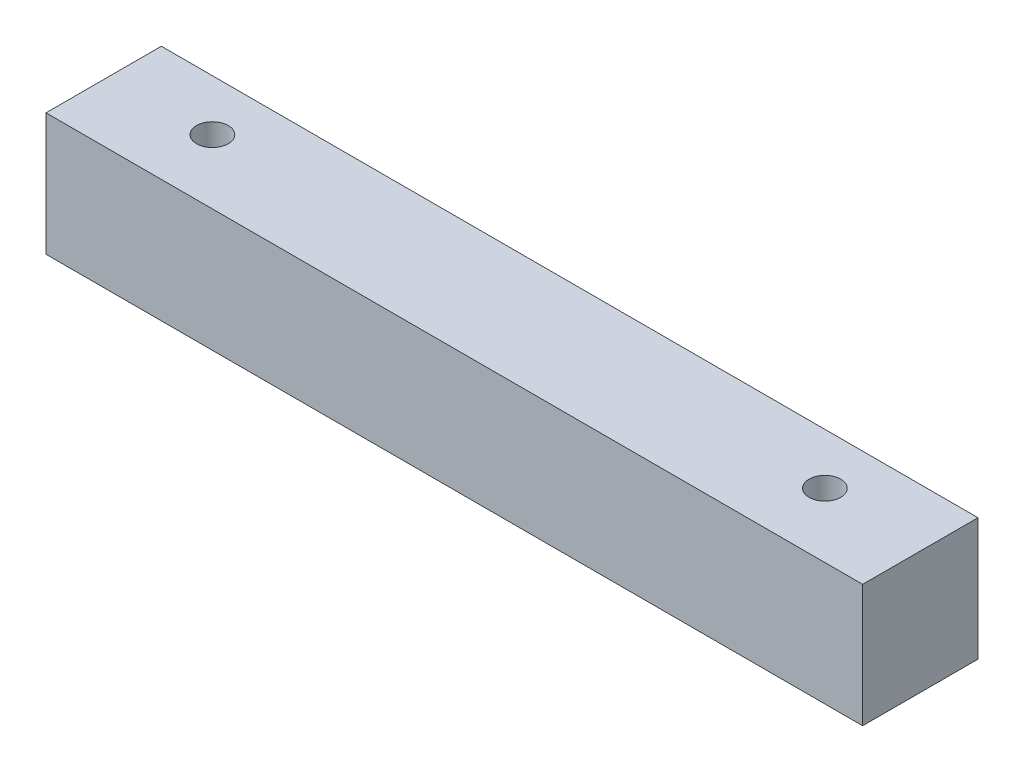
ISO-10303-21;
HEADER;
FILE_DESCRIPTION(('STEP AP214'),'2;1');
FILE_NAME('part.step','',(''),(''),'','','');
FILE_SCHEMA(('AUTOMOTIVE_DESIGN { 1 0 10303 214 1 1 1 1 }'));
ENDSEC;
DATA;
#1=APPLICATION_CONTEXT('core data for automotive mechanical design processes');
#2=APPLICATION_PROTOCOL_DEFINITION('international standard','automotive_design',2000,#1);
#3=PRODUCT_CONTEXT('',#1,'mechanical');
#4=PRODUCT('Part','Part','',(#3));
#5=PRODUCT_RELATED_PRODUCT_CATEGORY('part','',(#4));
#6=PRODUCT_DEFINITION_FORMATION('','',#4);
#7=PRODUCT_DEFINITION_CONTEXT('part definition',#1,'design');
#8=PRODUCT_DEFINITION('design','',#6,#7);
#9=PRODUCT_DEFINITION_SHAPE('','',#8);
#10=(LENGTH_UNIT() NAMED_UNIT(*) SI_UNIT(.MILLI.,.METRE.));
#11=(NAMED_UNIT(*) PLANE_ANGLE_UNIT() SI_UNIT($,.RADIAN.));
#12=(NAMED_UNIT(*) SI_UNIT($,.STERADIAN.) SOLID_ANGLE_UNIT());
#13=UNCERTAINTY_MEASURE_WITH_UNIT(LENGTH_MEASURE(1.E-05),#10,'distance_accuracy_value','');
#14=(GEOMETRIC_REPRESENTATION_CONTEXT(3) GLOBAL_UNCERTAINTY_ASSIGNED_CONTEXT((#13)) GLOBAL_UNIT_ASSIGNED_CONTEXT((#10,
#11,#12)) REPRESENTATION_CONTEXT('',''));
#15=CARTESIAN_POINT('',(0.,0.,0.));
#16=DIRECTION('',(0.,0.,1.));
#17=DIRECTION('',(1.,0.,0.));
#18=AXIS2_PLACEMENT_3D('',#15,#16,#17);
#19=CARTESIAN_POINT('',(0.,0.,11.5));
#20=DIRECTION('',(1.,0.,0.));
#21=DIRECTION('',(0.,0.,-1.));
#22=AXIS2_PLACEMENT_3D('',#19,#20,#21);
#23=PLANE('',#22);
#24=DIRECTION('',(0.,-1.,0.));
#25=VECTOR('',#24,1.);
#26=CARTESIAN_POINT('',(0.,12.,11.3));
#27=LINE('',#26,#25);
#28=CARTESIAN_POINT('',(0.,12.,11.3));
#29=VERTEX_POINT('',#28);
#30=CARTESIAN_POINT('',(0.,0.,11.3));
#31=VERTEX_POINT('',#30);
#32=EDGE_CURVE('E83',#29,#31,#27,.T.);
#33=ORIENTED_EDGE('',*,*,#32,.F.);
#34=DIRECTION('',(0.,0.,-1.));
#35=VECTOR('',#34,1.);
#36=CARTESIAN_POINT('',(0.,12.,11.5));
#37=LINE('',#36,#35);
#38=CARTESIAN_POINT('',(0.,12.,0.));
#39=VERTEX_POINT('',#38);
#40=EDGE_CURVE('E65',#29,#39,#37,.T.);
#41=ORIENTED_EDGE('',*,*,#40,.T.);
#42=DIRECTION('',(0.,-1.,0.));
#43=VECTOR('',#42,1.);
#44=CARTESIAN_POINT('',(0.,0.,0.));
#45=LINE('',#44,#43);
#46=CARTESIAN_POINT('',(0.,0.,0.));
#47=VERTEX_POINT('',#46);
#48=EDGE_CURVE('E119',#39,#47,#45,.T.);
#49=ORIENTED_EDGE('',*,*,#48,.T.);
#50=DIRECTION('',(0.,0.,-1.));
#51=VECTOR('',#50,1.);
#52=CARTESIAN_POINT('',(0.,0.,11.5));
#53=LINE('',#52,#51);
#54=EDGE_CURVE('E11',#31,#47,#53,.T.);
#55=ORIENTED_EDGE('',*,*,#54,.F.);
#56=EDGE_LOOP('',(#33,#41,#49,#55));
#57=FACE_BOUND('',#56,.T.);
#58=ADVANCED_FACE('F42',(#57),#23,.F.);
#59=CARTESIAN_POINT('',(0.,0.,11.5));
#60=DIRECTION('',(0.,1.,0.));
#61=DIRECTION('',(0.,0.,1.));
#62=AXIS2_PLACEMENT_3D('',#59,#60,#61);
#63=PLANE('',#62);
#64=CARTESIAN_POINT('',(70.,0.,5.00000000000001));
#65=DIRECTION('',(0.,1.,0.));
#66=DIRECTION('',(0.,0.,1.));
#67=AXIS2_PLACEMENT_3D('',#64,#65,#66);
#68=CIRCLE('',#67,1.55000000000001);
#69=CARTESIAN_POINT('',(70.,0.,6.55000000000002));
#70=VERTEX_POINT('',#69);
#71=EDGE_CURVE('E132',#70,#70,#68,.F.);
#72=ORIENTED_EDGE('',*,*,#71,.F.);
#73=EDGE_LOOP('',(#72));
#74=FACE_BOUND('',#73,.T.);
#75=CARTESIAN_POINT('',(9.99999999999999,0.,5.00000000000001));
#76=DIRECTION('',(0.,1.,0.));
#77=DIRECTION('',(0.,0.,1.));
#78=AXIS2_PLACEMENT_3D('',#75,#76,#77);
#79=CIRCLE('',#78,1.55);
#80=CARTESIAN_POINT('',(9.99999999999999,0.,6.55000000000001));
#81=VERTEX_POINT('',#80);
#82=EDGE_CURVE('E126',#81,#81,#79,.F.);
#83=ORIENTED_EDGE('',*,*,#82,.F.);
#84=EDGE_LOOP('',(#83));
#85=FACE_BOUND('',#84,.T.);
#86=DIRECTION('',(1.,0.,0.));
#87=VECTOR('',#86,1.);
#88=CARTESIAN_POINT('',(0.,0.,11.3));
#89=LINE('',#88,#87);
#90=CARTESIAN_POINT('',(80.,0.,11.3));
#91=VERTEX_POINT('',#90);
#92=EDGE_CURVE('E91',#31,#91,#89,.T.);
#93=ORIENTED_EDGE('',*,*,#92,.F.);
#94=ORIENTED_EDGE('',*,*,#54,.T.);
#95=DIRECTION('',(1.,0.,0.));
#96=VECTOR('',#95,1.);
#97=CARTESIAN_POINT('',(0.,0.,0.));
#98=LINE('',#97,#96);
#99=CARTESIAN_POINT('',(80.,0.,0.));
#100=VERTEX_POINT('',#99);
#101=EDGE_CURVE('E115',#47,#100,#98,.T.);
#102=ORIENTED_EDGE('',*,*,#101,.T.);
#103=DIRECTION('',(0.,0.,-1.));
#104=VECTOR('',#103,1.);
#105=CARTESIAN_POINT('',(80.,0.,11.5));
#106=LINE('',#105,#104);
#107=EDGE_CURVE('E50',#91,#100,#106,.T.);
#108=ORIENTED_EDGE('',*,*,#107,.F.);
#109=EDGE_LOOP('',(#93,#94,#102,#108));
#110=FACE_BOUND('',#109,.T.);
#111=ADVANCED_FACE('F116',(#74,#85,#110),#63,.F.);
#112=CARTESIAN_POINT('',(80.,0.,11.5));
#113=DIRECTION('',(-1.,0.,0.));
#114=DIRECTION('',(0.,0.,1.));
#115=AXIS2_PLACEMENT_3D('',#112,#113,#114);
#116=PLANE('',#115);
#117=DIRECTION('',(0.,1.,0.));
#118=VECTOR('',#117,1.);
#119=CARTESIAN_POINT('',(80.,0.,11.3));
#120=LINE('',#119,#118);
#121=CARTESIAN_POINT('',(80.,12.,11.3));
#122=VERTEX_POINT('',#121);
#123=EDGE_CURVE('E57',#91,#122,#120,.T.);
#124=ORIENTED_EDGE('',*,*,#123,.F.);
#125=ORIENTED_EDGE('',*,*,#107,.T.);
#126=DIRECTION('',(0.,1.,0.));
#127=VECTOR('',#126,1.);
#128=CARTESIAN_POINT('',(80.,0.,0.));
#129=LINE('',#128,#127);
#130=CARTESIAN_POINT('',(80.,12.,0.));
#131=VERTEX_POINT('',#130);
#132=EDGE_CURVE('E103',#100,#131,#129,.T.);
#133=ORIENTED_EDGE('',*,*,#132,.T.);
#134=DIRECTION('',(0.,0.,-1.));
#135=VECTOR('',#134,1.);
#136=CARTESIAN_POINT('',(80.,12.,11.5));
#137=LINE('',#136,#135);
#138=EDGE_CURVE('E98',#122,#131,#137,.T.);
#139=ORIENTED_EDGE('',*,*,#138,.F.);
#140=EDGE_LOOP('',(#124,#125,#133,#139));
#141=FACE_BOUND('',#140,.T.);
#142=ADVANCED_FACE('F111',(#141),#116,.F.);
#143=CARTESIAN_POINT('',(0.,12.,11.5));
#144=DIRECTION('',(0.,-1.,0.));
#145=DIRECTION('',(0.,0.,-1.));
#146=AXIS2_PLACEMENT_3D('',#143,#144,#145);
#147=PLANE('',#146);
#148=CARTESIAN_POINT('',(70.,12.,5.00000000000001));
#149=DIRECTION('',(0.,1.,0.));
#150=DIRECTION('',(0.,0.,-1.));
#151=AXIS2_PLACEMENT_3D('',#148,#149,#150);
#152=CIRCLE('',#151,1.55000000000001);
#153=CARTESIAN_POINT('',(70.,12.,3.45000000000001));
#154=VERTEX_POINT('',#153);
#155=EDGE_CURVE('E127',#154,#154,#152,.T.);
#156=ORIENTED_EDGE('',*,*,#155,.F.);
#157=EDGE_LOOP('',(#156));
#158=FACE_BOUND('',#157,.T.);
#159=CARTESIAN_POINT('',(9.99999999999999,12.,5.00000000000001));
#160=DIRECTION('',(0.,1.,0.));
#161=DIRECTION('',(0.,0.,1.));
#162=AXIS2_PLACEMENT_3D('',#159,#160,#161);
#163=CIRCLE('',#162,1.55);
#164=CARTESIAN_POINT('',(9.99999999999999,12.,6.55000000000001));
#165=VERTEX_POINT('',#164);
#166=EDGE_CURVE('E131',#165,#165,#163,.T.);
#167=ORIENTED_EDGE('',*,*,#166,.F.);
#168=EDGE_LOOP('',(#167));
#169=FACE_BOUND('',#168,.T.);
#170=DIRECTION('',(-1.,0.,0.));
#171=VECTOR('',#170,1.);
#172=CARTESIAN_POINT('',(80.,12.,11.3));
#173=LINE('',#172,#171);
#174=EDGE_CURVE('E81',#122,#29,#173,.T.);
#175=ORIENTED_EDGE('',*,*,#174,.F.);
#176=ORIENTED_EDGE('',*,*,#138,.T.);
#177=DIRECTION('',(-1.,0.,0.));
#178=VECTOR('',#177,1.);
#179=CARTESIAN_POINT('',(0.,12.,0.));
#180=LINE('',#179,#178);
#181=EDGE_CURVE('E95',#131,#39,#180,.T.);
#182=ORIENTED_EDGE('',*,*,#181,.T.);
#183=ORIENTED_EDGE('',*,*,#40,.F.);
#184=EDGE_LOOP('',(#175,#176,#182,#183));
#185=FACE_BOUND('',#184,.T.);
#186=ADVANCED_FACE('F93',(#158,#169,#185),#147,.F.);
#187=CARTESIAN_POINT('',(0.,0.,0.));
#188=DIRECTION('',(0.,0.,-1.));
#189=DIRECTION('',(-1.,0.,0.));
#190=AXIS2_PLACEMENT_3D('',#187,#188,#189);
#191=PLANE('',#190);
#192=ORIENTED_EDGE('',*,*,#48,.F.);
#193=ORIENTED_EDGE('',*,*,#181,.F.);
#194=ORIENTED_EDGE('',*,*,#132,.F.);
#195=ORIENTED_EDGE('',*,*,#101,.F.);
#196=EDGE_LOOP('',(#192,#193,#194,#195));
#197=FACE_BOUND('',#196,.T.);
#198=ADVANCED_FACE('F121',(#197),#191,.T.);
#199=CARTESIAN_POINT('',(70.,-0.000999999999999265,5.00000000000001));
#200=DIRECTION('',(0.,1.,0.));
#201=DIRECTION('',(0.,0.,1.));
#202=AXIS2_PLACEMENT_3D('',#199,#200,#201);
#203=CYLINDRICAL_SURFACE('',#202,1.55000000000001);
#204=ORIENTED_EDGE('',*,*,#155,.T.);
#205=EDGE_LOOP('',(#204));
#206=FACE_BOUND('',#205,.T.);
#207=ORIENTED_EDGE('',*,*,#71,.T.);
#208=EDGE_LOOP('',(#207));
#209=FACE_BOUND('',#208,.T.);
#210=ADVANCED_FACE('F158',(#206,#209),#203,.F.);
#211=CARTESIAN_POINT('',(9.99999999999999,-0.000999999999999265,5.00000000000001));
#212=DIRECTION('',(0.,1.,0.));
#213=DIRECTION('',(0.,0.,1.));
#214=AXIS2_PLACEMENT_3D('',#211,#212,#213);
#215=CYLINDRICAL_SURFACE('',#214,1.55);
#216=ORIENTED_EDGE('',*,*,#166,.T.);
#217=EDGE_LOOP('',(#216));
#218=FACE_BOUND('',#217,.T.);
#219=ORIENTED_EDGE('',*,*,#82,.T.);
#220=EDGE_LOOP('',(#219));
#221=FACE_BOUND('',#220,.T.);
#222=ADVANCED_FACE('F147',(#218,#221),#215,.F.);
#223=CARTESIAN_POINT('',(0.,0.,11.3));
#224=DIRECTION('',(0.,0.,1.));
#225=DIRECTION('',(1.,0.,0.));
#226=AXIS2_PLACEMENT_3D('',#223,#224,#225);
#227=PLANE('',#226);
#228=ORIENTED_EDGE('',*,*,#174,.T.);
#229=ORIENTED_EDGE('',*,*,#32,.T.);
#230=ORIENTED_EDGE('',*,*,#92,.T.);
#231=ORIENTED_EDGE('',*,*,#123,.T.);
#232=EDGE_LOOP('',(#228,#229,#230,#231));
#233=FACE_BOUND('',#232,.T.);
#234=ADVANCED_FACE('F82',(#233),#227,.T.);
#235=CLOSED_SHELL('',(#58,#111,#142,#186,#198,#210,#222,#234));
#236=MANIFOLD_SOLID_BREP('B2',#235);
#237=ADVANCED_BREP_SHAPE_REPRESENTATION('',(#18,#236),#14);
#238=SHAPE_DEFINITION_REPRESENTATION(#9,#237);
ENDSEC;
END-ISO-10303-21;
